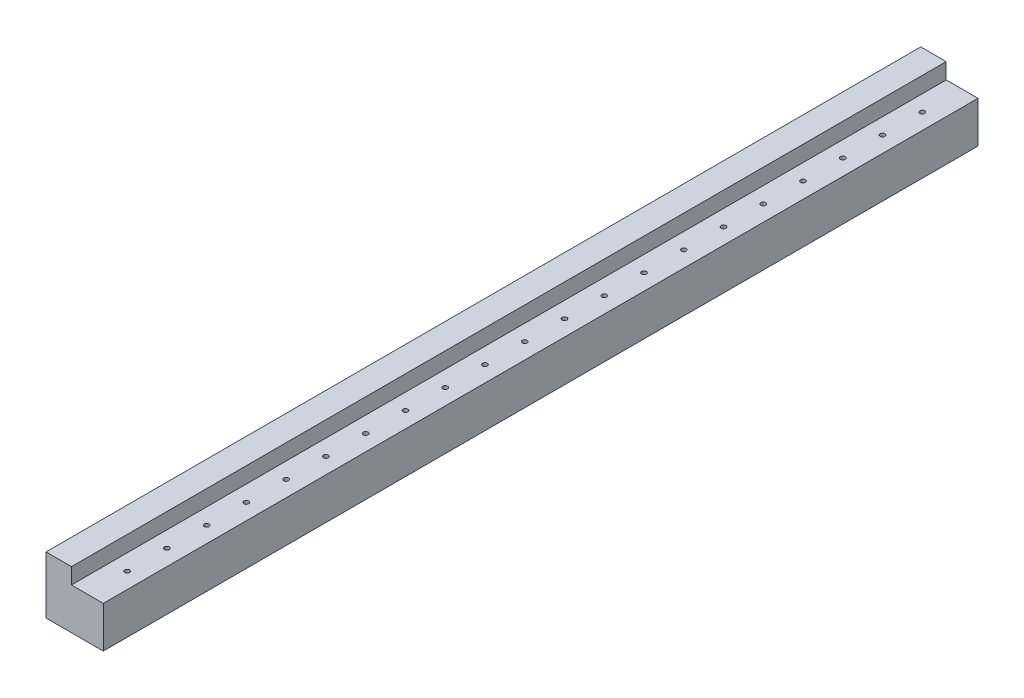
ISO-10303-21;
HEADER;
FILE_DESCRIPTION(('STEP AP214'),'2;1');
FILE_NAME('part.step','',(''),(''),'','','');
FILE_SCHEMA(('AUTOMOTIVE_DESIGN { 1 0 10303 214 1 1 1 1 }'));
ENDSEC;
DATA;
#1=APPLICATION_CONTEXT('core data for automotive mechanical design processes');
#2=APPLICATION_PROTOCOL_DEFINITION('international standard','automotive_design',2000,#1);
#3=PRODUCT_CONTEXT('',#1,'mechanical');
#4=PRODUCT('Part','Part','',(#3));
#5=PRODUCT_RELATED_PRODUCT_CATEGORY('part','',(#4));
#6=PRODUCT_DEFINITION_FORMATION('','',#4);
#7=PRODUCT_DEFINITION_CONTEXT('part definition',#1,'design');
#8=PRODUCT_DEFINITION('design','',#6,#7);
#9=PRODUCT_DEFINITION_SHAPE('','',#8);
#10=(LENGTH_UNIT() NAMED_UNIT(*) SI_UNIT(.MILLI.,.METRE.));
#11=(NAMED_UNIT(*) PLANE_ANGLE_UNIT() SI_UNIT($,.RADIAN.));
#12=(NAMED_UNIT(*) SI_UNIT($,.STERADIAN.) SOLID_ANGLE_UNIT());
#13=UNCERTAINTY_MEASURE_WITH_UNIT(LENGTH_MEASURE(1.E-05),#10,'distance_accuracy_value','');
#14=(GEOMETRIC_REPRESENTATION_CONTEXT(3) GLOBAL_UNCERTAINTY_ASSIGNED_CONTEXT((#13)) GLOBAL_UNIT_ASSIGNED_CONTEXT((#10,
#11,#12)) REPRESENTATION_CONTEXT('',''));
#15=CARTESIAN_POINT('',(0.,0.,0.));
#16=DIRECTION('',(0.,0.,1.));
#17=DIRECTION('',(1.,0.,0.));
#18=AXIS2_PLACEMENT_3D('',#15,#16,#17);
#19=CARTESIAN_POINT('',(18.,18.,550.));
#20=DIRECTION('',(-1.,0.,0.));
#21=DIRECTION('',(0.,0.,1.));
#22=AXIS2_PLACEMENT_3D('',#19,#20,#21);
#23=PLANE('',#22);
#24=DIRECTION('',(0.,1.,0.));
#25=VECTOR('',#24,1.);
#26=CARTESIAN_POINT('',(18.,18.,0.));
#27=LINE('',#26,#25);
#28=CARTESIAN_POINT('',(18.,-18.,0.));
#29=VERTEX_POINT('',#28);
#30=CARTESIAN_POINT('',(18.,8.,0.));
#31=VERTEX_POINT('',#30);
#32=EDGE_CURVE('E120',#29,#31,#27,.T.);
#33=ORIENTED_EDGE('',*,*,#32,.T.);
#34=DIRECTION('',(0.,0.,1.));
#35=VECTOR('',#34,1.);
#36=CARTESIAN_POINT('',(18.,8.,0.));
#37=LINE('',#36,#35);
#38=CARTESIAN_POINT('',(18.,8.,550.));
#39=VERTEX_POINT('',#38);
#40=EDGE_CURVE('E144',#31,#39,#37,.T.);
#41=ORIENTED_EDGE('',*,*,#40,.T.);
#42=DIRECTION('',(0.,1.,0.));
#43=VECTOR('',#42,1.);
#44=CARTESIAN_POINT('',(18.,18.,550.));
#45=LINE('',#44,#43);
#46=CARTESIAN_POINT('',(18.,-18.,550.));
#47=VERTEX_POINT('',#46);
#48=EDGE_CURVE('E132',#47,#39,#45,.T.);
#49=ORIENTED_EDGE('',*,*,#48,.F.);
#50=DIRECTION('',(0.,0.,-1.));
#51=VECTOR('',#50,1.);
#52=CARTESIAN_POINT('',(18.,-18.,550.));
#53=LINE('',#52,#51);
#54=EDGE_CURVE('E133',#47,#29,#53,.T.);
#55=ORIENTED_EDGE('',*,*,#54,.T.);
#56=EDGE_LOOP('',(#33,#41,#49,#55));
#57=FACE_BOUND('',#56,.T.);
#58=ADVANCED_FACE('F38',(#57),#23,.F.);
#59=CARTESIAN_POINT('',(-18.,18.,550.));
#60=DIRECTION('',(0.,-1.,0.));
#61=DIRECTION('',(0.,0.,-1.));
#62=AXIS2_PLACEMENT_3D('',#59,#60,#61);
#63=PLANE('',#62);
#64=DIRECTION('',(-1.,0.,0.));
#65=VECTOR('',#64,1.);
#66=CARTESIAN_POINT('',(-18.,18.,550.));
#67=LINE('',#66,#65);
#68=CARTESIAN_POINT('',(-2.00000000000001,18.,550.));
#69=VERTEX_POINT('',#68);
#70=CARTESIAN_POINT('',(-18.,18.,550.));
#71=VERTEX_POINT('',#70);
#72=EDGE_CURVE('E84',#69,#71,#67,.T.);
#73=ORIENTED_EDGE('',*,*,#72,.F.);
#74=DIRECTION('',(0.,0.,1.));
#75=VECTOR('',#74,1.);
#76=CARTESIAN_POINT('',(-2.00000000000001,18.,0.));
#77=LINE('',#76,#75);
#78=CARTESIAN_POINT('',(-2.00000000000001,18.,0.));
#79=VERTEX_POINT('',#78);
#80=EDGE_CURVE('E104',#79,#69,#77,.T.);
#81=ORIENTED_EDGE('',*,*,#80,.F.);
#82=DIRECTION('',(-1.,0.,0.));
#83=VECTOR('',#82,1.);
#84=CARTESIAN_POINT('',(-18.,18.,0.));
#85=LINE('',#84,#83);
#86=CARTESIAN_POINT('',(-18.,18.,0.));
#87=VERTEX_POINT('',#86);
#88=EDGE_CURVE('E113',#79,#87,#85,.T.);
#89=ORIENTED_EDGE('',*,*,#88,.T.);
#90=DIRECTION('',(0.,0.,-1.));
#91=VECTOR('',#90,1.);
#92=CARTESIAN_POINT('',(-18.,18.,550.));
#93=LINE('',#92,#91);
#94=EDGE_CURVE('E11',#71,#87,#93,.T.);
#95=ORIENTED_EDGE('',*,*,#94,.F.);
#96=EDGE_LOOP('',(#73,#81,#89,#95));
#97=FACE_BOUND('',#96,.T.);
#98=ADVANCED_FACE('F112',(#97),#63,.F.);
#99=CARTESIAN_POINT('',(-18.,18.,550.));
#100=DIRECTION('',(1.,0.,0.));
#101=DIRECTION('',(0.,0.,-1.));
#102=AXIS2_PLACEMENT_3D('',#99,#100,#101);
#103=PLANE('',#102);
#104=DIRECTION('',(0.,-1.,0.));
#105=VECTOR('',#104,1.);
#106=CARTESIAN_POINT('',(-18.,18.,0.));
#107=LINE('',#106,#105);
#108=CARTESIAN_POINT('',(-18.,-18.,0.));
#109=VERTEX_POINT('',#108);
#110=EDGE_CURVE('E118',#87,#109,#107,.T.);
#111=ORIENTED_EDGE('',*,*,#110,.T.);
#112=DIRECTION('',(0.,0.,-1.));
#113=VECTOR('',#112,1.);
#114=CARTESIAN_POINT('',(-18.,-18.,550.));
#115=LINE('',#114,#113);
#116=CARTESIAN_POINT('',(-18.,-18.,550.));
#117=VERTEX_POINT('',#116);
#118=EDGE_CURVE('E46',#117,#109,#115,.T.);
#119=ORIENTED_EDGE('',*,*,#118,.F.);
#120=DIRECTION('',(0.,-1.,0.));
#121=VECTOR('',#120,1.);
#122=CARTESIAN_POINT('',(-18.,18.,550.));
#123=LINE('',#122,#121);
#124=EDGE_CURVE('E149',#71,#117,#123,.T.);
#125=ORIENTED_EDGE('',*,*,#124,.F.);
#126=ORIENTED_EDGE('',*,*,#94,.T.);
#127=EDGE_LOOP('',(#111,#119,#125,#126));
#128=FACE_BOUND('',#127,.T.);
#129=ADVANCED_FACE('F157',(#128),#103,.F.);
#130=CARTESIAN_POINT('',(-18.,-18.,550.));
#131=DIRECTION('',(0.,1.,0.));
#132=DIRECTION('',(0.,0.,1.));
#133=AXIS2_PLACEMENT_3D('',#130,#131,#132);
#134=PLANE('',#133);
#135=DIRECTION('',(1.,0.,0.));
#136=VECTOR('',#135,1.);
#137=CARTESIAN_POINT('',(-18.,-18.,0.));
#138=LINE('',#137,#136);
#139=EDGE_CURVE('E79',#109,#29,#138,.T.);
#140=ORIENTED_EDGE('',*,*,#139,.T.);
#141=ORIENTED_EDGE('',*,*,#54,.F.);
#142=DIRECTION('',(1.,0.,0.));
#143=VECTOR('',#142,1.);
#144=CARTESIAN_POINT('',(-18.,-18.,550.));
#145=LINE('',#144,#143);
#146=EDGE_CURVE('E62',#117,#47,#145,.T.);
#147=ORIENTED_EDGE('',*,*,#146,.F.);
#148=ORIENTED_EDGE('',*,*,#118,.T.);
#149=EDGE_LOOP('',(#140,#141,#147,#148));
#150=FACE_BOUND('',#149,.T.);
#151=ADVANCED_FACE('F137',(#150),#134,.F.);
#152=CARTESIAN_POINT('',(0.,0.,550.));
#153=DIRECTION('',(0.,0.,1.));
#154=DIRECTION('',(1.,0.,0.));
#155=AXIS2_PLACEMENT_3D('',#152,#153,#154);
#156=PLANE('',#155);
#157=DIRECTION('',(1.,0.,0.));
#158=VECTOR('',#157,1.);
#159=CARTESIAN_POINT('',(0.,8.,550.));
#160=LINE('',#159,#158);
#161=CARTESIAN_POINT('',(-2.00000000000001,8.,550.));
#162=VERTEX_POINT('',#161);
#163=EDGE_CURVE('E126',#162,#39,#160,.T.);
#164=ORIENTED_EDGE('',*,*,#163,.F.);
#165=DIRECTION('',(0.,-1.,0.));
#166=VECTOR('',#165,1.);
#167=CARTESIAN_POINT('',(-2.00000000000001,0.,550.));
#168=LINE('',#167,#166);
#169=EDGE_CURVE('E669',#69,#162,#168,.T.);
#170=ORIENTED_EDGE('',*,*,#169,.F.);
#171=ORIENTED_EDGE('',*,*,#72,.T.);
#172=ORIENTED_EDGE('',*,*,#124,.T.);
#173=ORIENTED_EDGE('',*,*,#146,.T.);
#174=ORIENTED_EDGE('',*,*,#48,.T.);
#175=EDGE_LOOP('',(#164,#170,#171,#172,#173,#174));
#176=FACE_BOUND('',#175,.T.);
#177=ADVANCED_FACE('F156',(#176),#156,.T.);
#178=CARTESIAN_POINT('',(0.,0.,0.));
#179=DIRECTION('',(0.,0.,1.));
#180=DIRECTION('',(1.,0.,0.));
#181=AXIS2_PLACEMENT_3D('',#178,#179,#180);
#182=PLANE('',#181);
#183=DIRECTION('',(0.,-1.,0.));
#184=VECTOR('',#183,1.);
#185=CARTESIAN_POINT('',(-2.00000000000001,18.,0.));
#186=LINE('',#185,#184);
#187=CARTESIAN_POINT('',(-2.00000000000001,8.,0.));
#188=VERTEX_POINT('',#187);
#189=EDGE_CURVE('E101',#79,#188,#186,.T.);
#190=ORIENTED_EDGE('',*,*,#189,.T.);
#191=DIRECTION('',(1.,0.,0.));
#192=VECTOR('',#191,1.);
#193=CARTESIAN_POINT('',(18.,8.,0.));
#194=LINE('',#193,#192);
#195=EDGE_CURVE('E53',#188,#31,#194,.T.);
#196=ORIENTED_EDGE('',*,*,#195,.T.);
#197=ORIENTED_EDGE('',*,*,#32,.F.);
#198=ORIENTED_EDGE('',*,*,#139,.F.);
#199=ORIENTED_EDGE('',*,*,#110,.F.);
#200=ORIENTED_EDGE('',*,*,#88,.F.);
#201=EDGE_LOOP('',(#190,#196,#197,#198,#199,#200));
#202=FACE_BOUND('',#201,.T.);
#203=ADVANCED_FACE('F117',(#202),#182,.F.);
#204=CARTESIAN_POINT('',(18.,8.,0.));
#205=DIRECTION('',(0.,-1.,0.));
#206=DIRECTION('',(1.,0.,0.));
#207=AXIS2_PLACEMENT_3D('',#204,#205,#206);
#208=PLANE('',#207);
#209=CARTESIAN_POINT('',(7.99999999999999,8.,525.));
#210=DIRECTION('',(0.,1.,0.));
#211=DIRECTION('',(-1.,0.,0.));
#212=AXIS2_PLACEMENT_3D('',#209,#210,#211);
#213=CIRCLE('',#212,1.5);
#214=CARTESIAN_POINT('',(6.49999999999999,8.,525.));
#215=VERTEX_POINT('',#214);
#216=EDGE_CURVE('E638',#215,#215,#213,.T.);
#217=ORIENTED_EDGE('',*,*,#216,.F.);
#218=EDGE_LOOP('',(#217));
#219=FACE_BOUND('',#218,.T.);
#220=CARTESIAN_POINT('',(7.99999999999999,8.,500.));
#221=DIRECTION('',(0.,1.,0.));
#222=DIRECTION('',(-1.,0.,0.));
#223=AXIS2_PLACEMENT_3D('',#220,#221,#222);
#224=CIRCLE('',#223,1.5);
#225=CARTESIAN_POINT('',(6.49999999999999,8.,500.));
#226=VERTEX_POINT('',#225);
#227=EDGE_CURVE('E637',#226,#226,#224,.T.);
#228=ORIENTED_EDGE('',*,*,#227,.F.);
#229=EDGE_LOOP('',(#228));
#230=FACE_BOUND('',#229,.T.);
#231=CARTESIAN_POINT('',(7.99999999999999,8.,475.));
#232=DIRECTION('',(0.,1.,0.));
#233=DIRECTION('',(-1.,0.,0.));
#234=AXIS2_PLACEMENT_3D('',#231,#232,#233);
#235=CIRCLE('',#234,1.5);
#236=CARTESIAN_POINT('',(6.49999999999999,8.,475.));
#237=VERTEX_POINT('',#236);
#238=EDGE_CURVE('E804',#237,#237,#235,.T.);
#239=ORIENTED_EDGE('',*,*,#238,.F.);
#240=EDGE_LOOP('',(#239));
#241=FACE_BOUND('',#240,.T.);
#242=CARTESIAN_POINT('',(7.99999999999999,8.,450.));
#243=DIRECTION('',(0.,1.,0.));
#244=DIRECTION('',(-1.,0.,0.));
#245=AXIS2_PLACEMENT_3D('',#242,#243,#244);
#246=CIRCLE('',#245,1.5);
#247=CARTESIAN_POINT('',(6.49999999999999,8.,450.));
#248=VERTEX_POINT('',#247);
#249=EDGE_CURVE('E796',#248,#248,#246,.T.);
#250=ORIENTED_EDGE('',*,*,#249,.F.);
#251=EDGE_LOOP('',(#250));
#252=FACE_BOUND('',#251,.T.);
#253=CARTESIAN_POINT('',(7.99999999999999,8.,225.));
#254=DIRECTION('',(0.,1.,0.));
#255=DIRECTION('',(-1.,0.,0.));
#256=AXIS2_PLACEMENT_3D('',#253,#254,#255);
#257=CIRCLE('',#256,1.5);
#258=CARTESIAN_POINT('',(6.49999999999999,8.,225.));
#259=VERTEX_POINT('',#258);
#260=EDGE_CURVE('E676',#259,#259,#257,.T.);
#261=ORIENTED_EDGE('',*,*,#260,.F.);
#262=EDGE_LOOP('',(#261));
#263=FACE_BOUND('',#262,.T.);
#264=CARTESIAN_POINT('',(7.99999999999999,8.,200.));
#265=DIRECTION('',(0.,1.,0.));
#266=DIRECTION('',(-1.,0.,0.));
#267=AXIS2_PLACEMENT_3D('',#264,#265,#266);
#268=CIRCLE('',#267,1.5);
#269=CARTESIAN_POINT('',(6.49999999999999,8.,200.));
#270=VERTEX_POINT('',#269);
#271=EDGE_CURVE('E684',#270,#270,#268,.T.);
#272=ORIENTED_EDGE('',*,*,#271,.F.);
#273=EDGE_LOOP('',(#272));
#274=FACE_BOUND('',#273,.T.);
#275=CARTESIAN_POINT('',(7.99999999999999,8.,175.));
#276=DIRECTION('',(0.,1.,0.));
#277=DIRECTION('',(-1.,0.,0.));
#278=AXIS2_PLACEMENT_3D('',#275,#276,#277);
#279=CIRCLE('',#278,1.5);
#280=CARTESIAN_POINT('',(6.49999999999999,8.,175.));
#281=VERTEX_POINT('',#280);
#282=EDGE_CURVE('E692',#281,#281,#279,.T.);
#283=ORIENTED_EDGE('',*,*,#282,.F.);
#284=EDGE_LOOP('',(#283));
#285=FACE_BOUND('',#284,.T.);
#286=CARTESIAN_POINT('',(7.99999999999999,8.,150.));
#287=DIRECTION('',(0.,1.,0.));
#288=DIRECTION('',(-1.,0.,0.));
#289=AXIS2_PLACEMENT_3D('',#286,#287,#288);
#290=CIRCLE('',#289,1.5);
#291=CARTESIAN_POINT('',(6.49999999999999,8.,150.));
#292=VERTEX_POINT('',#291);
#293=EDGE_CURVE('E700',#292,#292,#290,.T.);
#294=ORIENTED_EDGE('',*,*,#293,.F.);
#295=EDGE_LOOP('',(#294));
#296=FACE_BOUND('',#295,.T.);
#297=CARTESIAN_POINT('',(7.99999999999999,8.,125.));
#298=DIRECTION('',(0.,1.,0.));
#299=DIRECTION('',(-1.,0.,0.));
#300=AXIS2_PLACEMENT_3D('',#297,#298,#299);
#301=CIRCLE('',#300,1.5);
#302=CARTESIAN_POINT('',(6.49999999999999,8.,125.));
#303=VERTEX_POINT('',#302);
#304=EDGE_CURVE('E708',#303,#303,#301,.T.);
#305=ORIENTED_EDGE('',*,*,#304,.F.);
#306=EDGE_LOOP('',(#305));
#307=FACE_BOUND('',#306,.T.);
#308=CARTESIAN_POINT('',(7.99999999999999,8.,100.));
#309=DIRECTION('',(0.,1.,0.));
#310=DIRECTION('',(-1.,0.,0.));
#311=AXIS2_PLACEMENT_3D('',#308,#309,#310);
#312=CIRCLE('',#311,1.5);
#313=CARTESIAN_POINT('',(6.49999999999999,8.,100.));
#314=VERTEX_POINT('',#313);
#315=EDGE_CURVE('E716',#314,#314,#312,.T.);
#316=ORIENTED_EDGE('',*,*,#315,.F.);
#317=EDGE_LOOP('',(#316));
#318=FACE_BOUND('',#317,.T.);
#319=CARTESIAN_POINT('',(7.99999999999999,8.,75.));
#320=DIRECTION('',(0.,1.,0.));
#321=DIRECTION('',(-1.,0.,0.));
#322=AXIS2_PLACEMENT_3D('',#319,#320,#321);
#323=CIRCLE('',#322,1.5);
#324=CARTESIAN_POINT('',(6.49999999999999,8.,75.));
#325=VERTEX_POINT('',#324);
#326=EDGE_CURVE('E724',#325,#325,#323,.T.);
#327=ORIENTED_EDGE('',*,*,#326,.F.);
#328=EDGE_LOOP('',(#327));
#329=FACE_BOUND('',#328,.T.);
#330=CARTESIAN_POINT('',(7.99999999999999,8.,50.));
#331=DIRECTION('',(0.,1.,0.));
#332=DIRECTION('',(-1.,0.,0.));
#333=AXIS2_PLACEMENT_3D('',#330,#331,#332);
#334=CIRCLE('',#333,1.5);
#335=CARTESIAN_POINT('',(6.49999999999999,8.,50.));
#336=VERTEX_POINT('',#335);
#337=EDGE_CURVE('E732',#336,#336,#334,.T.);
#338=ORIENTED_EDGE('',*,*,#337,.F.);
#339=EDGE_LOOP('',(#338));
#340=FACE_BOUND('',#339,.T.);
#341=CARTESIAN_POINT('',(7.99999999999999,8.,325.));
#342=DIRECTION('',(0.,1.,0.));
#343=DIRECTION('',(-1.,0.,0.));
#344=AXIS2_PLACEMENT_3D('',#341,#342,#343);
#345=CIRCLE('',#344,1.5);
#346=CARTESIAN_POINT('',(6.49999999999999,8.,325.));
#347=VERTEX_POINT('',#346);
#348=EDGE_CURVE('E756',#347,#347,#345,.T.);
#349=ORIENTED_EDGE('',*,*,#348,.F.);
#350=EDGE_LOOP('',(#349));
#351=FACE_BOUND('',#350,.T.);
#352=CARTESIAN_POINT('',(7.99999999999999,8.,300.));
#353=DIRECTION('',(0.,1.,0.));
#354=DIRECTION('',(-1.,0.,0.));
#355=AXIS2_PLACEMENT_3D('',#352,#353,#354);
#356=CIRCLE('',#355,1.5);
#357=CARTESIAN_POINT('',(6.49999999999999,8.,300.));
#358=VERTEX_POINT('',#357);
#359=EDGE_CURVE('E748',#358,#358,#356,.T.);
#360=ORIENTED_EDGE('',*,*,#359,.F.);
#361=EDGE_LOOP('',(#360));
#362=FACE_BOUND('',#361,.T.);
#363=CARTESIAN_POINT('',(7.99999999999999,8.,25.));
#364=DIRECTION('',(0.,1.,0.));
#365=DIRECTION('',(-1.,0.,0.));
#366=AXIS2_PLACEMENT_3D('',#363,#364,#365);
#367=CIRCLE('',#366,1.5);
#368=CARTESIAN_POINT('',(6.49999999999999,8.,25.));
#369=VERTEX_POINT('',#368);
#370=EDGE_CURVE('E740',#369,#369,#367,.T.);
#371=ORIENTED_EDGE('',*,*,#370,.F.);
#372=EDGE_LOOP('',(#371));
#373=FACE_BOUND('',#372,.T.);
#374=CARTESIAN_POINT('',(7.99999999999999,8.,350.));
#375=DIRECTION('',(0.,1.,0.));
#376=DIRECTION('',(-1.,0.,0.));
#377=AXIS2_PLACEMENT_3D('',#374,#375,#376);
#378=CIRCLE('',#377,1.5);
#379=CARTESIAN_POINT('',(6.49999999999999,8.,350.));
#380=VERTEX_POINT('',#379);
#381=EDGE_CURVE('E764',#380,#380,#378,.T.);
#382=ORIENTED_EDGE('',*,*,#381,.F.);
#383=EDGE_LOOP('',(#382));
#384=FACE_BOUND('',#383,.T.);
#385=CARTESIAN_POINT('',(7.99999999999999,8.,375.));
#386=DIRECTION('',(0.,1.,0.));
#387=DIRECTION('',(-1.,0.,0.));
#388=AXIS2_PLACEMENT_3D('',#385,#386,#387);
#389=CIRCLE('',#388,1.5);
#390=CARTESIAN_POINT('',(6.49999999999999,8.,375.));
#391=VERTEX_POINT('',#390);
#392=EDGE_CURVE('E772',#391,#391,#389,.T.);
#393=ORIENTED_EDGE('',*,*,#392,.F.);
#394=EDGE_LOOP('',(#393));
#395=FACE_BOUND('',#394,.T.);
#396=CARTESIAN_POINT('',(7.99999999999999,8.,400.));
#397=DIRECTION('',(0.,1.,0.));
#398=DIRECTION('',(-1.,0.,0.));
#399=AXIS2_PLACEMENT_3D('',#396,#397,#398);
#400=CIRCLE('',#399,1.5);
#401=CARTESIAN_POINT('',(6.49999999999999,8.,400.));
#402=VERTEX_POINT('',#401);
#403=EDGE_CURVE('E780',#402,#402,#400,.T.);
#404=ORIENTED_EDGE('',*,*,#403,.F.);
#405=EDGE_LOOP('',(#404));
#406=FACE_BOUND('',#405,.T.);
#407=CARTESIAN_POINT('',(7.99999999999999,8.,425.));
#408=DIRECTION('',(0.,1.,0.));
#409=DIRECTION('',(-1.,0.,0.));
#410=AXIS2_PLACEMENT_3D('',#407,#408,#409);
#411=CIRCLE('',#410,1.5);
#412=CARTESIAN_POINT('',(6.49999999999999,8.,425.));
#413=VERTEX_POINT('',#412);
#414=EDGE_CURVE('E788',#413,#413,#411,.T.);
#415=ORIENTED_EDGE('',*,*,#414,.F.);
#416=EDGE_LOOP('',(#415));
#417=FACE_BOUND('',#416,.T.);
#418=CARTESIAN_POINT('',(7.99999999999999,8.,250.));
#419=DIRECTION('',(0.,1.,0.));
#420=DIRECTION('',(-1.,0.,0.));
#421=AXIS2_PLACEMENT_3D('',#418,#419,#420);
#422=CIRCLE('',#421,1.5);
#423=CARTESIAN_POINT('',(6.49999999999999,8.,250.));
#424=VERTEX_POINT('',#423);
#425=EDGE_CURVE('E649',#424,#424,#422,.T.);
#426=ORIENTED_EDGE('',*,*,#425,.F.);
#427=EDGE_LOOP('',(#426));
#428=FACE_BOUND('',#427,.T.);
#429=CARTESIAN_POINT('',(7.99999999999999,8.,275.));
#430=DIRECTION('',(0.,1.,0.));
#431=DIRECTION('',(-1.,0.,0.));
#432=AXIS2_PLACEMENT_3D('',#429,#430,#431);
#433=CIRCLE('',#432,1.5);
#434=CARTESIAN_POINT('',(6.49999999999999,8.,275.));
#435=VERTEX_POINT('',#434);
#436=EDGE_CURVE('E658',#435,#435,#433,.T.);
#437=ORIENTED_EDGE('',*,*,#436,.F.);
#438=EDGE_LOOP('',(#437));
#439=FACE_BOUND('',#438,.T.);
#440=ORIENTED_EDGE('',*,*,#163,.T.);
#441=ORIENTED_EDGE('',*,*,#40,.F.);
#442=ORIENTED_EDGE('',*,*,#195,.F.);
#443=DIRECTION('',(0.,0.,1.));
#444=VECTOR('',#443,1.);
#445=CARTESIAN_POINT('',(-2.00000000000001,8.,0.));
#446=LINE('',#445,#444);
#447=EDGE_CURVE('E105',#188,#162,#446,.T.);
#448=ORIENTED_EDGE('',*,*,#447,.T.);
#449=EDGE_LOOP('',(#440,#441,#442,#448));
#450=FACE_BOUND('',#449,.T.);
#451=ADVANCED_FACE('F192',(#219,#230,#241,#252,#263,#274,#285,#296,#307,#318,#329,#340,#351,
#362,#373,#384,#395,#406,#417,#428,#439,#450),#208,.F.);
#452=CARTESIAN_POINT('',(-2.00000000000001,18.,0.));
#453=DIRECTION('',(-1.,0.,0.));
#454=DIRECTION('',(0.,-1.,0.));
#455=AXIS2_PLACEMENT_3D('',#452,#453,#454);
#456=PLANE('',#455);
#457=ORIENTED_EDGE('',*,*,#169,.T.);
#458=ORIENTED_EDGE('',*,*,#447,.F.);
#459=ORIENTED_EDGE('',*,*,#189,.F.);
#460=ORIENTED_EDGE('',*,*,#80,.T.);
#461=EDGE_LOOP('',(#457,#458,#459,#460));
#462=FACE_BOUND('',#461,.T.);
#463=ADVANCED_FACE('F103',(#462),#456,.F.);
#464=CARTESIAN_POINT('',(7.99999999999999,-12.,275.));
#465=DIRECTION('',(0.,1.,0.));
#466=DIRECTION('',(-1.,0.,0.));
#467=AXIS2_PLACEMENT_3D('',#464,#465,#466);
#468=CYLINDRICAL_SURFACE('',#467,1.5);
#469=CARTESIAN_POINT('',(7.99999999999999,-12.,275.));
#470=DIRECTION('',(0.,1.,0.));
#471=DIRECTION('',(-1.,0.,0.));
#472=AXIS2_PLACEMENT_3D('',#469,#470,#471);
#473=CIRCLE('',#472,1.5);
#474=CARTESIAN_POINT('',(6.49999999999999,-12.,275.));
#475=VERTEX_POINT('',#474);
#476=EDGE_CURVE('E109',#475,#475,#473,.T.);
#477=ORIENTED_EDGE('',*,*,#476,.F.);
#478=EDGE_LOOP('',(#477));
#479=FACE_BOUND('',#478,.T.);
#480=ORIENTED_EDGE('',*,*,#436,.T.);
#481=EDGE_LOOP('',(#480));
#482=FACE_BOUND('',#481,.T.);
#483=ADVANCED_FACE('F203',(#479,#482),#468,.F.);
#484=CARTESIAN_POINT('',(7.99999999999999,-12.,275.));
#485=DIRECTION('',(0.,1.,0.));
#486=DIRECTION('',(-1.,0.,0.));
#487=AXIS2_PLACEMENT_3D('',#484,#485,#486);
#488=PLANE('',#487);
#489=ORIENTED_EDGE('',*,*,#476,.T.);
#490=EDGE_LOOP('',(#489));
#491=FACE_BOUND('',#490,.T.);
#492=ADVANCED_FACE('F212',(#491),#488,.T.);
#493=CARTESIAN_POINT('',(7.99999999999999,-12.,250.));
#494=DIRECTION('',(0.,1.,0.));
#495=DIRECTION('',(-1.,0.,0.));
#496=AXIS2_PLACEMENT_3D('',#493,#494,#495);
#497=CYLINDRICAL_SURFACE('',#496,1.5);
#498=CARTESIAN_POINT('',(7.99999999999999,-12.,250.));
#499=DIRECTION('',(0.,1.,0.));
#500=DIRECTION('',(-1.,0.,0.));
#501=AXIS2_PLACEMENT_3D('',#498,#499,#500);
#502=CIRCLE('',#501,1.5);
#503=CARTESIAN_POINT('',(6.49999999999999,-12.,250.));
#504=VERTEX_POINT('',#503);
#505=EDGE_CURVE('E653',#504,#504,#502,.T.);
#506=ORIENTED_EDGE('',*,*,#505,.F.);
#507=EDGE_LOOP('',(#506));
#508=FACE_BOUND('',#507,.T.);
#509=ORIENTED_EDGE('',*,*,#425,.T.);
#510=EDGE_LOOP('',(#509));
#511=FACE_BOUND('',#510,.T.);
#512=ADVANCED_FACE('F222',(#508,#511),#497,.F.);
#513=CARTESIAN_POINT('',(7.99999999999999,-12.,250.));
#514=DIRECTION('',(0.,1.,0.));
#515=DIRECTION('',(-1.,0.,0.));
#516=AXIS2_PLACEMENT_3D('',#513,#514,#515);
#517=PLANE('',#516);
#518=ORIENTED_EDGE('',*,*,#505,.T.);
#519=EDGE_LOOP('',(#518));
#520=FACE_BOUND('',#519,.T.);
#521=ADVANCED_FACE('F239',(#520),#517,.T.);
#522=CARTESIAN_POINT('',(7.99999999999999,-12.,425.));
#523=DIRECTION('',(0.,1.,0.));
#524=DIRECTION('',(-1.,0.,0.));
#525=AXIS2_PLACEMENT_3D('',#522,#523,#524);
#526=CYLINDRICAL_SURFACE('',#525,1.5);
#527=CARTESIAN_POINT('',(7.99999999999999,-12.,425.));
#528=DIRECTION('',(0.,1.,0.));
#529=DIRECTION('',(-1.,0.,0.));
#530=AXIS2_PLACEMENT_3D('',#527,#528,#529);
#531=CIRCLE('',#530,1.5);
#532=CARTESIAN_POINT('',(6.49999999999999,-12.,425.));
#533=VERTEX_POINT('',#532);
#534=EDGE_CURVE('E784',#533,#533,#531,.T.);
#535=ORIENTED_EDGE('',*,*,#534,.F.);
#536=EDGE_LOOP('',(#535));
#537=FACE_BOUND('',#536,.T.);
#538=ORIENTED_EDGE('',*,*,#414,.T.);
#539=EDGE_LOOP('',(#538));
#540=FACE_BOUND('',#539,.T.);
#541=ADVANCED_FACE('F249',(#537,#540),#526,.F.);
#542=CARTESIAN_POINT('',(7.99999999999999,-12.,425.));
#543=DIRECTION('',(0.,1.,0.));
#544=DIRECTION('',(-1.,0.,0.));
#545=AXIS2_PLACEMENT_3D('',#542,#543,#544);
#546=PLANE('',#545);
#547=ORIENTED_EDGE('',*,*,#534,.T.);
#548=EDGE_LOOP('',(#547));
#549=FACE_BOUND('',#548,.T.);
#550=ADVANCED_FACE('F259',(#549),#546,.T.);
#551=CARTESIAN_POINT('',(7.99999999999999,-12.,400.));
#552=DIRECTION('',(0.,1.,0.));
#553=DIRECTION('',(-1.,0.,0.));
#554=AXIS2_PLACEMENT_3D('',#551,#552,#553);
#555=CYLINDRICAL_SURFACE('',#554,1.5);
#556=CARTESIAN_POINT('',(7.99999999999999,-12.,400.));
#557=DIRECTION('',(0.,1.,0.));
#558=DIRECTION('',(-1.,0.,0.));
#559=AXIS2_PLACEMENT_3D('',#556,#557,#558);
#560=CIRCLE('',#559,1.5);
#561=CARTESIAN_POINT('',(6.49999999999999,-12.,400.));
#562=VERTEX_POINT('',#561);
#563=EDGE_CURVE('E776',#562,#562,#560,.T.);
#564=ORIENTED_EDGE('',*,*,#563,.F.);
#565=EDGE_LOOP('',(#564));
#566=FACE_BOUND('',#565,.T.);
#567=ORIENTED_EDGE('',*,*,#403,.T.);
#568=EDGE_LOOP('',(#567));
#569=FACE_BOUND('',#568,.T.);
#570=ADVANCED_FACE('F269',(#566,#569),#555,.F.);
#571=CARTESIAN_POINT('',(7.99999999999999,-12.,400.));
#572=DIRECTION('',(0.,1.,0.));
#573=DIRECTION('',(-1.,0.,0.));
#574=AXIS2_PLACEMENT_3D('',#571,#572,#573);
#575=PLANE('',#574);
#576=ORIENTED_EDGE('',*,*,#563,.T.);
#577=EDGE_LOOP('',(#576));
#578=FACE_BOUND('',#577,.T.);
#579=ADVANCED_FACE('F279',(#578),#575,.T.);
#580=CARTESIAN_POINT('',(7.99999999999999,-12.,375.));
#581=DIRECTION('',(0.,1.,0.));
#582=DIRECTION('',(-1.,0.,0.));
#583=AXIS2_PLACEMENT_3D('',#580,#581,#582);
#584=CYLINDRICAL_SURFACE('',#583,1.5);
#585=CARTESIAN_POINT('',(7.99999999999999,-12.,375.));
#586=DIRECTION('',(0.,1.,0.));
#587=DIRECTION('',(-1.,0.,0.));
#588=AXIS2_PLACEMENT_3D('',#585,#586,#587);
#589=CIRCLE('',#588,1.5);
#590=CARTESIAN_POINT('',(6.49999999999999,-12.,375.));
#591=VERTEX_POINT('',#590);
#592=EDGE_CURVE('E768',#591,#591,#589,.T.);
#593=ORIENTED_EDGE('',*,*,#592,.F.);
#594=EDGE_LOOP('',(#593));
#595=FACE_BOUND('',#594,.T.);
#596=ORIENTED_EDGE('',*,*,#392,.T.);
#597=EDGE_LOOP('',(#596));
#598=FACE_BOUND('',#597,.T.);
#599=ADVANCED_FACE('F289',(#595,#598),#584,.F.);
#600=CARTESIAN_POINT('',(7.99999999999999,-12.,375.));
#601=DIRECTION('',(0.,1.,0.));
#602=DIRECTION('',(-1.,0.,0.));
#603=AXIS2_PLACEMENT_3D('',#600,#601,#602);
#604=PLANE('',#603);
#605=ORIENTED_EDGE('',*,*,#592,.T.);
#606=EDGE_LOOP('',(#605));
#607=FACE_BOUND('',#606,.T.);
#608=ADVANCED_FACE('F299',(#607),#604,.T.);
#609=CARTESIAN_POINT('',(7.99999999999999,-12.,350.));
#610=DIRECTION('',(0.,1.,0.));
#611=DIRECTION('',(-1.,0.,0.));
#612=AXIS2_PLACEMENT_3D('',#609,#610,#611);
#613=CYLINDRICAL_SURFACE('',#612,1.5);
#614=CARTESIAN_POINT('',(7.99999999999999,-12.,350.));
#615=DIRECTION('',(0.,1.,0.));
#616=DIRECTION('',(-1.,0.,0.));
#617=AXIS2_PLACEMENT_3D('',#614,#615,#616);
#618=CIRCLE('',#617,1.5);
#619=CARTESIAN_POINT('',(6.49999999999999,-12.,350.));
#620=VERTEX_POINT('',#619);
#621=EDGE_CURVE('E760',#620,#620,#618,.T.);
#622=ORIENTED_EDGE('',*,*,#621,.F.);
#623=EDGE_LOOP('',(#622));
#624=FACE_BOUND('',#623,.T.);
#625=ORIENTED_EDGE('',*,*,#381,.T.);
#626=EDGE_LOOP('',(#625));
#627=FACE_BOUND('',#626,.T.);
#628=ADVANCED_FACE('F309',(#624,#627),#613,.F.);
#629=CARTESIAN_POINT('',(7.99999999999999,-12.,350.));
#630=DIRECTION('',(0.,1.,0.));
#631=DIRECTION('',(-1.,0.,0.));
#632=AXIS2_PLACEMENT_3D('',#629,#630,#631);
#633=PLANE('',#632);
#634=ORIENTED_EDGE('',*,*,#621,.T.);
#635=EDGE_LOOP('',(#634));
#636=FACE_BOUND('',#635,.T.);
#637=ADVANCED_FACE('F319',(#636),#633,.T.);
#638=CARTESIAN_POINT('',(7.99999999999999,-12.,25.));
#639=DIRECTION('',(0.,1.,0.));
#640=DIRECTION('',(-1.,0.,0.));
#641=AXIS2_PLACEMENT_3D('',#638,#639,#640);
#642=CYLINDRICAL_SURFACE('',#641,1.5);
#643=CARTESIAN_POINT('',(7.99999999999999,-12.,25.));
#644=DIRECTION('',(0.,1.,0.));
#645=DIRECTION('',(-1.,0.,0.));
#646=AXIS2_PLACEMENT_3D('',#643,#644,#645);
#647=CIRCLE('',#646,1.5);
#648=CARTESIAN_POINT('',(6.49999999999999,-12.,25.));
#649=VERTEX_POINT('',#648);
#650=EDGE_CURVE('E736',#649,#649,#647,.T.);
#651=ORIENTED_EDGE('',*,*,#650,.F.);
#652=EDGE_LOOP('',(#651));
#653=FACE_BOUND('',#652,.T.);
#654=ORIENTED_EDGE('',*,*,#370,.T.);
#655=EDGE_LOOP('',(#654));
#656=FACE_BOUND('',#655,.T.);
#657=ADVANCED_FACE('F329',(#653,#656),#642,.F.);
#658=CARTESIAN_POINT('',(7.99999999999999,-12.,25.));
#659=DIRECTION('',(0.,1.,0.));
#660=DIRECTION('',(-1.,0.,0.));
#661=AXIS2_PLACEMENT_3D('',#658,#659,#660);
#662=PLANE('',#661);
#663=ORIENTED_EDGE('',*,*,#650,.T.);
#664=EDGE_LOOP('',(#663));
#665=FACE_BOUND('',#664,.T.);
#666=ADVANCED_FACE('F339',(#665),#662,.T.);
#667=CARTESIAN_POINT('',(7.99999999999999,-12.,300.));
#668=DIRECTION('',(0.,1.,0.));
#669=DIRECTION('',(-1.,0.,0.));
#670=AXIS2_PLACEMENT_3D('',#667,#668,#669);
#671=CYLINDRICAL_SURFACE('',#670,1.5);
#672=CARTESIAN_POINT('',(7.99999999999999,-12.,300.));
#673=DIRECTION('',(0.,1.,0.));
#674=DIRECTION('',(-1.,0.,0.));
#675=AXIS2_PLACEMENT_3D('',#672,#673,#674);
#676=CIRCLE('',#675,1.5);
#677=CARTESIAN_POINT('',(6.49999999999999,-12.,300.));
#678=VERTEX_POINT('',#677);
#679=EDGE_CURVE('E744',#678,#678,#676,.T.);
#680=ORIENTED_EDGE('',*,*,#679,.F.);
#681=EDGE_LOOP('',(#680));
#682=FACE_BOUND('',#681,.T.);
#683=ORIENTED_EDGE('',*,*,#359,.T.);
#684=EDGE_LOOP('',(#683));
#685=FACE_BOUND('',#684,.T.);
#686=ADVANCED_FACE('F349',(#682,#685),#671,.F.);
#687=CARTESIAN_POINT('',(7.99999999999999,-12.,300.));
#688=DIRECTION('',(0.,1.,0.));
#689=DIRECTION('',(-1.,0.,0.));
#690=AXIS2_PLACEMENT_3D('',#687,#688,#689);
#691=PLANE('',#690);
#692=ORIENTED_EDGE('',*,*,#679,.T.);
#693=EDGE_LOOP('',(#692));
#694=FACE_BOUND('',#693,.T.);
#695=ADVANCED_FACE('F359',(#694),#691,.T.);
#696=CARTESIAN_POINT('',(7.99999999999999,-12.,325.));
#697=DIRECTION('',(0.,1.,0.));
#698=DIRECTION('',(-1.,0.,0.));
#699=AXIS2_PLACEMENT_3D('',#696,#697,#698);
#700=CYLINDRICAL_SURFACE('',#699,1.5);
#701=CARTESIAN_POINT('',(7.99999999999999,-12.,325.));
#702=DIRECTION('',(0.,1.,0.));
#703=DIRECTION('',(-1.,0.,0.));
#704=AXIS2_PLACEMENT_3D('',#701,#702,#703);
#705=CIRCLE('',#704,1.5);
#706=CARTESIAN_POINT('',(6.49999999999999,-12.,325.));
#707=VERTEX_POINT('',#706);
#708=EDGE_CURVE('E752',#707,#707,#705,.T.);
#709=ORIENTED_EDGE('',*,*,#708,.F.);
#710=EDGE_LOOP('',(#709));
#711=FACE_BOUND('',#710,.T.);
#712=ORIENTED_EDGE('',*,*,#348,.T.);
#713=EDGE_LOOP('',(#712));
#714=FACE_BOUND('',#713,.T.);
#715=ADVANCED_FACE('F369',(#711,#714),#700,.F.);
#716=CARTESIAN_POINT('',(7.99999999999999,-12.,325.));
#717=DIRECTION('',(0.,1.,0.));
#718=DIRECTION('',(-1.,0.,0.));
#719=AXIS2_PLACEMENT_3D('',#716,#717,#718);
#720=PLANE('',#719);
#721=ORIENTED_EDGE('',*,*,#708,.T.);
#722=EDGE_LOOP('',(#721));
#723=FACE_BOUND('',#722,.T.);
#724=ADVANCED_FACE('F379',(#723),#720,.T.);
#725=CARTESIAN_POINT('',(7.99999999999999,-12.,50.));
#726=DIRECTION('',(0.,1.,0.));
#727=DIRECTION('',(-1.,0.,0.));
#728=AXIS2_PLACEMENT_3D('',#725,#726,#727);
#729=CYLINDRICAL_SURFACE('',#728,1.5);
#730=CARTESIAN_POINT('',(7.99999999999999,-12.,50.));
#731=DIRECTION('',(0.,1.,0.));
#732=DIRECTION('',(-1.,0.,0.));
#733=AXIS2_PLACEMENT_3D('',#730,#731,#732);
#734=CIRCLE('',#733,1.5);
#735=CARTESIAN_POINT('',(6.49999999999999,-12.,50.));
#736=VERTEX_POINT('',#735);
#737=EDGE_CURVE('E728',#736,#736,#734,.T.);
#738=ORIENTED_EDGE('',*,*,#737,.F.);
#739=EDGE_LOOP('',(#738));
#740=FACE_BOUND('',#739,.T.);
#741=ORIENTED_EDGE('',*,*,#337,.T.);
#742=EDGE_LOOP('',(#741));
#743=FACE_BOUND('',#742,.T.);
#744=ADVANCED_FACE('F389',(#740,#743),#729,.F.);
#745=CARTESIAN_POINT('',(7.99999999999999,-12.,50.));
#746=DIRECTION('',(0.,1.,0.));
#747=DIRECTION('',(-1.,0.,0.));
#748=AXIS2_PLACEMENT_3D('',#745,#746,#747);
#749=PLANE('',#748);
#750=ORIENTED_EDGE('',*,*,#737,.T.);
#751=EDGE_LOOP('',(#750));
#752=FACE_BOUND('',#751,.T.);
#753=ADVANCED_FACE('F399',(#752),#749,.T.);
#754=CARTESIAN_POINT('',(7.99999999999999,-12.,75.));
#755=DIRECTION('',(0.,1.,0.));
#756=DIRECTION('',(-1.,0.,0.));
#757=AXIS2_PLACEMENT_3D('',#754,#755,#756);
#758=CYLINDRICAL_SURFACE('',#757,1.5);
#759=CARTESIAN_POINT('',(7.99999999999999,-12.,75.));
#760=DIRECTION('',(0.,1.,0.));
#761=DIRECTION('',(-1.,0.,0.));
#762=AXIS2_PLACEMENT_3D('',#759,#760,#761);
#763=CIRCLE('',#762,1.5);
#764=CARTESIAN_POINT('',(6.49999999999999,-12.,75.));
#765=VERTEX_POINT('',#764);
#766=EDGE_CURVE('E720',#765,#765,#763,.T.);
#767=ORIENTED_EDGE('',*,*,#766,.F.);
#768=EDGE_LOOP('',(#767));
#769=FACE_BOUND('',#768,.T.);
#770=ORIENTED_EDGE('',*,*,#326,.T.);
#771=EDGE_LOOP('',(#770));
#772=FACE_BOUND('',#771,.T.);
#773=ADVANCED_FACE('F409',(#769,#772),#758,.F.);
#774=CARTESIAN_POINT('',(7.99999999999999,-12.,75.));
#775=DIRECTION('',(0.,1.,0.));
#776=DIRECTION('',(-1.,0.,0.));
#777=AXIS2_PLACEMENT_3D('',#774,#775,#776);
#778=PLANE('',#777);
#779=ORIENTED_EDGE('',*,*,#766,.T.);
#780=EDGE_LOOP('',(#779));
#781=FACE_BOUND('',#780,.T.);
#782=ADVANCED_FACE('F419',(#781),#778,.T.);
#783=CARTESIAN_POINT('',(7.99999999999999,-12.,100.));
#784=DIRECTION('',(0.,1.,0.));
#785=DIRECTION('',(-1.,0.,0.));
#786=AXIS2_PLACEMENT_3D('',#783,#784,#785);
#787=CYLINDRICAL_SURFACE('',#786,1.5);
#788=CARTESIAN_POINT('',(7.99999999999999,-12.,100.));
#789=DIRECTION('',(0.,1.,0.));
#790=DIRECTION('',(-1.,0.,0.));
#791=AXIS2_PLACEMENT_3D('',#788,#789,#790);
#792=CIRCLE('',#791,1.5);
#793=CARTESIAN_POINT('',(6.49999999999999,-12.,100.));
#794=VERTEX_POINT('',#793);
#795=EDGE_CURVE('E712',#794,#794,#792,.T.);
#796=ORIENTED_EDGE('',*,*,#795,.F.);
#797=EDGE_LOOP('',(#796));
#798=FACE_BOUND('',#797,.T.);
#799=ORIENTED_EDGE('',*,*,#315,.T.);
#800=EDGE_LOOP('',(#799));
#801=FACE_BOUND('',#800,.T.);
#802=ADVANCED_FACE('F429',(#798,#801),#787,.F.);
#803=CARTESIAN_POINT('',(7.99999999999999,-12.,100.));
#804=DIRECTION('',(0.,1.,0.));
#805=DIRECTION('',(-1.,0.,0.));
#806=AXIS2_PLACEMENT_3D('',#803,#804,#805);
#807=PLANE('',#806);
#808=ORIENTED_EDGE('',*,*,#795,.T.);
#809=EDGE_LOOP('',(#808));
#810=FACE_BOUND('',#809,.T.);
#811=ADVANCED_FACE('F439',(#810),#807,.T.);
#812=CARTESIAN_POINT('',(7.99999999999999,-12.,125.));
#813=DIRECTION('',(0.,1.,0.));
#814=DIRECTION('',(-1.,0.,0.));
#815=AXIS2_PLACEMENT_3D('',#812,#813,#814);
#816=CYLINDRICAL_SURFACE('',#815,1.5);
#817=CARTESIAN_POINT('',(7.99999999999999,-12.,125.));
#818=DIRECTION('',(0.,1.,0.));
#819=DIRECTION('',(-1.,0.,0.));
#820=AXIS2_PLACEMENT_3D('',#817,#818,#819);
#821=CIRCLE('',#820,1.5);
#822=CARTESIAN_POINT('',(6.49999999999999,-12.,125.));
#823=VERTEX_POINT('',#822);
#824=EDGE_CURVE('E704',#823,#823,#821,.T.);
#825=ORIENTED_EDGE('',*,*,#824,.F.);
#826=EDGE_LOOP('',(#825));
#827=FACE_BOUND('',#826,.T.);
#828=ORIENTED_EDGE('',*,*,#304,.T.);
#829=EDGE_LOOP('',(#828));
#830=FACE_BOUND('',#829,.T.);
#831=ADVANCED_FACE('F449',(#827,#830),#816,.F.);
#832=CARTESIAN_POINT('',(7.99999999999999,-12.,125.));
#833=DIRECTION('',(0.,1.,0.));
#834=DIRECTION('',(-1.,0.,0.));
#835=AXIS2_PLACEMENT_3D('',#832,#833,#834);
#836=PLANE('',#835);
#837=ORIENTED_EDGE('',*,*,#824,.T.);
#838=EDGE_LOOP('',(#837));
#839=FACE_BOUND('',#838,.T.);
#840=ADVANCED_FACE('F459',(#839),#836,.T.);
#841=CARTESIAN_POINT('',(7.99999999999999,-12.,150.));
#842=DIRECTION('',(0.,1.,0.));
#843=DIRECTION('',(-1.,0.,0.));
#844=AXIS2_PLACEMENT_3D('',#841,#842,#843);
#845=CYLINDRICAL_SURFACE('',#844,1.5);
#846=CARTESIAN_POINT('',(7.99999999999999,-12.,150.));
#847=DIRECTION('',(0.,1.,0.));
#848=DIRECTION('',(-1.,0.,0.));
#849=AXIS2_PLACEMENT_3D('',#846,#847,#848);
#850=CIRCLE('',#849,1.5);
#851=CARTESIAN_POINT('',(6.49999999999999,-12.,150.));
#852=VERTEX_POINT('',#851);
#853=EDGE_CURVE('E696',#852,#852,#850,.T.);
#854=ORIENTED_EDGE('',*,*,#853,.F.);
#855=EDGE_LOOP('',(#854));
#856=FACE_BOUND('',#855,.T.);
#857=ORIENTED_EDGE('',*,*,#293,.T.);
#858=EDGE_LOOP('',(#857));
#859=FACE_BOUND('',#858,.T.);
#860=ADVANCED_FACE('F469',(#856,#859),#845,.F.);
#861=CARTESIAN_POINT('',(7.99999999999999,-12.,150.));
#862=DIRECTION('',(0.,1.,0.));
#863=DIRECTION('',(-1.,0.,0.));
#864=AXIS2_PLACEMENT_3D('',#861,#862,#863);
#865=PLANE('',#864);
#866=ORIENTED_EDGE('',*,*,#853,.T.);
#867=EDGE_LOOP('',(#866));
#868=FACE_BOUND('',#867,.T.);
#869=ADVANCED_FACE('F479',(#868),#865,.T.);
#870=CARTESIAN_POINT('',(7.99999999999999,-12.,175.));
#871=DIRECTION('',(0.,1.,0.));
#872=DIRECTION('',(-1.,0.,0.));
#873=AXIS2_PLACEMENT_3D('',#870,#871,#872);
#874=CYLINDRICAL_SURFACE('',#873,1.5);
#875=CARTESIAN_POINT('',(7.99999999999999,-12.,175.));
#876=DIRECTION('',(0.,1.,0.));
#877=DIRECTION('',(-1.,0.,0.));
#878=AXIS2_PLACEMENT_3D('',#875,#876,#877);
#879=CIRCLE('',#878,1.5);
#880=CARTESIAN_POINT('',(6.49999999999999,-12.,175.));
#881=VERTEX_POINT('',#880);
#882=EDGE_CURVE('E688',#881,#881,#879,.T.);
#883=ORIENTED_EDGE('',*,*,#882,.F.);
#884=EDGE_LOOP('',(#883));
#885=FACE_BOUND('',#884,.T.);
#886=ORIENTED_EDGE('',*,*,#282,.T.);
#887=EDGE_LOOP('',(#886));
#888=FACE_BOUND('',#887,.T.);
#889=ADVANCED_FACE('F489',(#885,#888),#874,.F.);
#890=CARTESIAN_POINT('',(7.99999999999999,-12.,175.));
#891=DIRECTION('',(0.,1.,0.));
#892=DIRECTION('',(-1.,0.,0.));
#893=AXIS2_PLACEMENT_3D('',#890,#891,#892);
#894=PLANE('',#893);
#895=ORIENTED_EDGE('',*,*,#882,.T.);
#896=EDGE_LOOP('',(#895));
#897=FACE_BOUND('',#896,.T.);
#898=ADVANCED_FACE('F499',(#897),#894,.T.);
#899=CARTESIAN_POINT('',(7.99999999999999,-12.,200.));
#900=DIRECTION('',(0.,1.,0.));
#901=DIRECTION('',(-1.,0.,0.));
#902=AXIS2_PLACEMENT_3D('',#899,#900,#901);
#903=CYLINDRICAL_SURFACE('',#902,1.5);
#904=CARTESIAN_POINT('',(7.99999999999999,-12.,200.));
#905=DIRECTION('',(0.,1.,0.));
#906=DIRECTION('',(-1.,0.,0.));
#907=AXIS2_PLACEMENT_3D('',#904,#905,#906);
#908=CIRCLE('',#907,1.5);
#909=CARTESIAN_POINT('',(6.49999999999999,-12.,200.));
#910=VERTEX_POINT('',#909);
#911=EDGE_CURVE('E680',#910,#910,#908,.T.);
#912=ORIENTED_EDGE('',*,*,#911,.F.);
#913=EDGE_LOOP('',(#912));
#914=FACE_BOUND('',#913,.T.);
#915=ORIENTED_EDGE('',*,*,#271,.T.);
#916=EDGE_LOOP('',(#915));
#917=FACE_BOUND('',#916,.T.);
#918=ADVANCED_FACE('F509',(#914,#917),#903,.F.);
#919=CARTESIAN_POINT('',(7.99999999999999,-12.,200.));
#920=DIRECTION('',(0.,1.,0.));
#921=DIRECTION('',(-1.,0.,0.));
#922=AXIS2_PLACEMENT_3D('',#919,#920,#921);
#923=PLANE('',#922);
#924=ORIENTED_EDGE('',*,*,#911,.T.);
#925=EDGE_LOOP('',(#924));
#926=FACE_BOUND('',#925,.T.);
#927=ADVANCED_FACE('F519',(#926),#923,.T.);
#928=CARTESIAN_POINT('',(7.99999999999999,-12.,225.));
#929=DIRECTION('',(0.,1.,0.));
#930=DIRECTION('',(-1.,0.,0.));
#931=AXIS2_PLACEMENT_3D('',#928,#929,#930);
#932=CYLINDRICAL_SURFACE('',#931,1.5);
#933=CARTESIAN_POINT('',(7.99999999999999,-12.,225.));
#934=DIRECTION('',(0.,1.,0.));
#935=DIRECTION('',(-1.,0.,0.));
#936=AXIS2_PLACEMENT_3D('',#933,#934,#935);
#937=CIRCLE('',#936,1.5);
#938=CARTESIAN_POINT('',(6.49999999999999,-12.,225.));
#939=VERTEX_POINT('',#938);
#940=EDGE_CURVE('E654',#939,#939,#937,.T.);
#941=ORIENTED_EDGE('',*,*,#940,.F.);
#942=EDGE_LOOP('',(#941));
#943=FACE_BOUND('',#942,.T.);
#944=ORIENTED_EDGE('',*,*,#260,.T.);
#945=EDGE_LOOP('',(#944));
#946=FACE_BOUND('',#945,.T.);
#947=ADVANCED_FACE('F529',(#943,#946),#932,.F.);
#948=CARTESIAN_POINT('',(7.99999999999999,-12.,225.));
#949=DIRECTION('',(0.,1.,0.));
#950=DIRECTION('',(-1.,0.,0.));
#951=AXIS2_PLACEMENT_3D('',#948,#949,#950);
#952=PLANE('',#951);
#953=ORIENTED_EDGE('',*,*,#940,.T.);
#954=EDGE_LOOP('',(#953));
#955=FACE_BOUND('',#954,.T.);
#956=ADVANCED_FACE('F539',(#955),#952,.T.);
#957=CARTESIAN_POINT('',(7.99999999999999,-12.,450.));
#958=DIRECTION('',(0.,1.,0.));
#959=DIRECTION('',(-1.,0.,0.));
#960=AXIS2_PLACEMENT_3D('',#957,#958,#959);
#961=CYLINDRICAL_SURFACE('',#960,1.5);
#962=CARTESIAN_POINT('',(7.99999999999999,-12.,450.));
#963=DIRECTION('',(0.,1.,0.));
#964=DIRECTION('',(-1.,0.,0.));
#965=AXIS2_PLACEMENT_3D('',#962,#963,#964);
#966=CIRCLE('',#965,1.5);
#967=CARTESIAN_POINT('',(6.49999999999999,-12.,450.));
#968=VERTEX_POINT('',#967);
#969=EDGE_CURVE('E792',#968,#968,#966,.T.);
#970=ORIENTED_EDGE('',*,*,#969,.F.);
#971=EDGE_LOOP('',(#970));
#972=FACE_BOUND('',#971,.T.);
#973=ORIENTED_EDGE('',*,*,#249,.T.);
#974=EDGE_LOOP('',(#973));
#975=FACE_BOUND('',#974,.T.);
#976=ADVANCED_FACE('F549',(#972,#975),#961,.F.);
#977=CARTESIAN_POINT('',(7.99999999999999,-12.,450.));
#978=DIRECTION('',(0.,1.,0.));
#979=DIRECTION('',(-1.,0.,0.));
#980=AXIS2_PLACEMENT_3D('',#977,#978,#979);
#981=PLANE('',#980);
#982=ORIENTED_EDGE('',*,*,#969,.T.);
#983=EDGE_LOOP('',(#982));
#984=FACE_BOUND('',#983,.T.);
#985=ADVANCED_FACE('F559',(#984),#981,.T.);
#986=CARTESIAN_POINT('',(7.99999999999999,-12.,475.));
#987=DIRECTION('',(0.,1.,0.));
#988=DIRECTION('',(-1.,0.,0.));
#989=AXIS2_PLACEMENT_3D('',#986,#987,#988);
#990=CYLINDRICAL_SURFACE('',#989,1.5);
#991=CARTESIAN_POINT('',(7.99999999999999,-12.,475.));
#992=DIRECTION('',(0.,1.,0.));
#993=DIRECTION('',(-1.,0.,0.));
#994=AXIS2_PLACEMENT_3D('',#991,#992,#993);
#995=CIRCLE('',#994,1.5);
#996=CARTESIAN_POINT('',(6.49999999999999,-12.,475.));
#997=VERTEX_POINT('',#996);
#998=EDGE_CURVE('E800',#997,#997,#995,.T.);
#999=ORIENTED_EDGE('',*,*,#998,.F.);
#1000=EDGE_LOOP('',(#999));
#1001=FACE_BOUND('',#1000,.T.);
#1002=ORIENTED_EDGE('',*,*,#238,.T.);
#1003=EDGE_LOOP('',(#1002));
#1004=FACE_BOUND('',#1003,.T.);
#1005=ADVANCED_FACE('F569',(#1001,#1004),#990,.F.);
#1006=CARTESIAN_POINT('',(7.99999999999999,-12.,475.));
#1007=DIRECTION('',(0.,1.,0.));
#1008=DIRECTION('',(-1.,0.,0.));
#1009=AXIS2_PLACEMENT_3D('',#1006,#1007,#1008);
#1010=PLANE('',#1009);
#1011=ORIENTED_EDGE('',*,*,#998,.T.);
#1012=EDGE_LOOP('',(#1011));
#1013=FACE_BOUND('',#1012,.T.);
#1014=ADVANCED_FACE('F579',(#1013),#1010,.T.);
#1015=CARTESIAN_POINT('',(7.99999999999999,-12.,500.));
#1016=DIRECTION('',(0.,1.,0.));
#1017=DIRECTION('',(-1.,0.,0.));
#1018=AXIS2_PLACEMENT_3D('',#1015,#1016,#1017);
#1019=CYLINDRICAL_SURFACE('',#1018,1.5);
#1020=CARTESIAN_POINT('',(7.99999999999999,-12.,500.));
#1021=DIRECTION('',(0.,1.,0.));
#1022=DIRECTION('',(-1.,0.,0.));
#1023=AXIS2_PLACEMENT_3D('',#1020,#1021,#1022);
#1024=CIRCLE('',#1023,1.5);
#1025=CARTESIAN_POINT('',(6.49999999999999,-12.,500.));
#1026=VERTEX_POINT('',#1025);
#1027=EDGE_CURVE('E643',#1026,#1026,#1024,.T.);
#1028=ORIENTED_EDGE('',*,*,#1027,.F.);
#1029=EDGE_LOOP('',(#1028));
#1030=FACE_BOUND('',#1029,.T.);
#1031=ORIENTED_EDGE('',*,*,#227,.T.);
#1032=EDGE_LOOP('',(#1031));
#1033=FACE_BOUND('',#1032,.T.);
#1034=ADVANCED_FACE('F589',(#1030,#1033),#1019,.F.);
#1035=CARTESIAN_POINT('',(7.99999999999999,-12.,500.));
#1036=DIRECTION('',(0.,1.,0.));
#1037=DIRECTION('',(-1.,0.,0.));
#1038=AXIS2_PLACEMENT_3D('',#1035,#1036,#1037);
#1039=PLANE('',#1038);
#1040=ORIENTED_EDGE('',*,*,#1027,.T.);
#1041=EDGE_LOOP('',(#1040));
#1042=FACE_BOUND('',#1041,.T.);
#1043=ADVANCED_FACE('F599',(#1042),#1039,.T.);
#1044=CARTESIAN_POINT('',(7.99999999999999,-12.,525.));
#1045=DIRECTION('',(0.,1.,0.));
#1046=DIRECTION('',(-1.,0.,0.));
#1047=AXIS2_PLACEMENT_3D('',#1044,#1045,#1046);
#1048=CYLINDRICAL_SURFACE('',#1047,1.5);
#1049=CARTESIAN_POINT('',(7.99999999999999,-12.,525.));
#1050=DIRECTION('',(0.,1.,0.));
#1051=DIRECTION('',(-1.,0.,0.));
#1052=AXIS2_PLACEMENT_3D('',#1049,#1050,#1051);
#1053=CIRCLE('',#1052,1.5);
#1054=CARTESIAN_POINT('',(6.49999999999999,-12.,525.));
#1055=VERTEX_POINT('',#1054);
#1056=EDGE_CURVE('E635',#1055,#1055,#1053,.T.);
#1057=ORIENTED_EDGE('',*,*,#1056,.F.);
#1058=EDGE_LOOP('',(#1057));
#1059=FACE_BOUND('',#1058,.T.);
#1060=ORIENTED_EDGE('',*,*,#216,.T.);
#1061=EDGE_LOOP('',(#1060));
#1062=FACE_BOUND('',#1061,.T.);
#1063=ADVANCED_FACE('F609',(#1059,#1062),#1048,.F.);
#1064=CARTESIAN_POINT('',(7.99999999999999,-12.,525.));
#1065=DIRECTION('',(0.,1.,0.));
#1066=DIRECTION('',(-1.,0.,0.));
#1067=AXIS2_PLACEMENT_3D('',#1064,#1065,#1066);
#1068=PLANE('',#1067);
#1069=ORIENTED_EDGE('',*,*,#1056,.T.);
#1070=EDGE_LOOP('',(#1069));
#1071=FACE_BOUND('',#1070,.T.);
#1072=ADVANCED_FACE('F619',(#1071),#1068,.T.);
#1073=CLOSED_SHELL('',(#58,#98,#129,#151,#177,#203,#451,#463,#483,#492,#512,#521,#541,#550,#570,
#579,#599,#608,#628,#637,#657,#666,#686,#695,#715,#724,#744,#753,#773,#782,#802,#811,#831,#840,
#860,#869,#889,#898,#918,#927,#947,#956,#976,#985,#1005,#1014,#1034,#1043,#1063,#1072));
#1074=MANIFOLD_SOLID_BREP('B2',#1073);
#1075=ADVANCED_BREP_SHAPE_REPRESENTATION('',(#18,#1074),#14);
#1076=SHAPE_DEFINITION_REPRESENTATION(#9,#1075);
ENDSEC;
END-ISO-10303-21;
